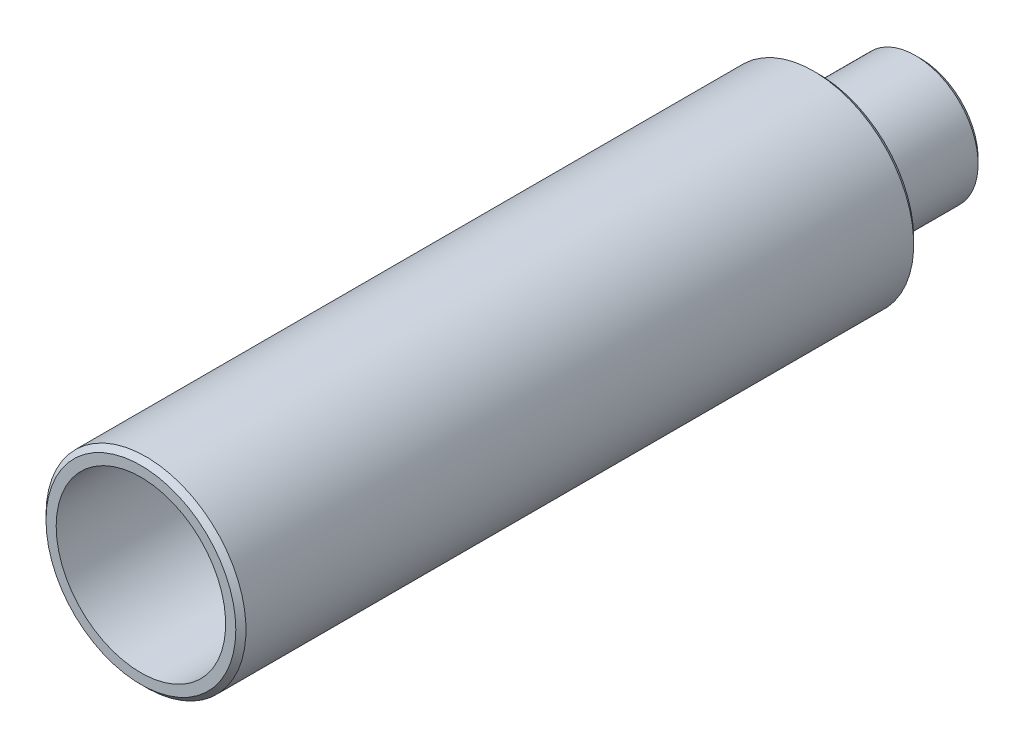
ISO-10303-21;
HEADER;
FILE_DESCRIPTION(('STEP AP214'),'2;1');
FILE_NAME('part.step','',(''),(''),'','','');
FILE_SCHEMA(('AUTOMOTIVE_DESIGN { 1 0 10303 214 1 1 1 1 }'));
ENDSEC;
DATA;
#1=APPLICATION_CONTEXT('core data for automotive mechanical design processes');
#2=APPLICATION_PROTOCOL_DEFINITION('international standard','automotive_design',2000,#1);
#3=PRODUCT_CONTEXT('',#1,'mechanical');
#4=PRODUCT('Part','Part','',(#3));
#5=PRODUCT_RELATED_PRODUCT_CATEGORY('part','',(#4));
#6=PRODUCT_DEFINITION_FORMATION('','',#4);
#7=PRODUCT_DEFINITION_CONTEXT('part definition',#1,'design');
#8=PRODUCT_DEFINITION('design','',#6,#7);
#9=PRODUCT_DEFINITION_SHAPE('','',#8);
#10=(LENGTH_UNIT() NAMED_UNIT(*) SI_UNIT(.MILLI.,.METRE.));
#11=(NAMED_UNIT(*) PLANE_ANGLE_UNIT() SI_UNIT($,.RADIAN.));
#12=(NAMED_UNIT(*) SI_UNIT($,.STERADIAN.) SOLID_ANGLE_UNIT());
#13=UNCERTAINTY_MEASURE_WITH_UNIT(LENGTH_MEASURE(1.E-05),#10,'distance_accuracy_value','');
#14=(GEOMETRIC_REPRESENTATION_CONTEXT(3) GLOBAL_UNCERTAINTY_ASSIGNED_CONTEXT((#13)) GLOBAL_UNIT_ASSIGNED_CONTEXT((#10,
#11,#12)) REPRESENTATION_CONTEXT('',''));
#15=CARTESIAN_POINT('',(0.,0.,0.));
#16=DIRECTION('',(0.,0.,1.));
#17=DIRECTION('',(1.,0.,0.));
#18=AXIS2_PLACEMENT_3D('',#15,#16,#17);
#19=CARTESIAN_POINT('',(0.,0.,40.));
#20=DIRECTION('',(0.,0.,-1.));
#21=DIRECTION('',(-1.,0.,0.));
#22=AXIS2_PLACEMENT_3D('',#19,#20,#21);
#23=PLANE('',#22);
#24=CARTESIAN_POINT('',(0.,0.,40.));
#25=DIRECTION('',(0.,0.,-1.));
#26=DIRECTION('',(-1.,0.,0.));
#27=AXIS2_PLACEMENT_3D('',#24,#25,#26);
#28=CIRCLE('',#27,5.6);
#29=CARTESIAN_POINT('',(-5.6,0.,40.));
#30=VERTEX_POINT('',#29);
#31=EDGE_CURVE('E10',#30,#30,#28,.T.);
#32=ORIENTED_EDGE('',*,*,#31,.F.);
#33=EDGE_LOOP('',(#32));
#34=FACE_BOUND('',#33,.T.);
#35=CARTESIAN_POINT('',(0.,0.,40.));
#36=DIRECTION('',(0.,0.,-1.));
#37=DIRECTION('',(-1.,0.,0.));
#38=AXIS2_PLACEMENT_3D('',#35,#36,#37);
#39=CIRCLE('',#38,5.);
#40=CARTESIAN_POINT('',(-4.99999999999999,0.,40.));
#41=VERTEX_POINT('',#40);
#42=EDGE_CURVE('E92',#41,#41,#39,.T.);
#43=ORIENTED_EDGE('',*,*,#42,.T.);
#44=EDGE_LOOP('',(#43));
#45=FACE_BOUND('',#44,.T.);
#46=ADVANCED_FACE('F43',(#34,#45),#23,.F.);
#47=CARTESIAN_POINT('',(0.,0.,40.));
#48=DIRECTION('',(0.,0.,-1.));
#49=DIRECTION('',(-1.,0.,0.));
#50=AXIS2_PLACEMENT_3D('',#47,#48,#49);
#51=CONICAL_SURFACE('',#50,5.6,0.785398163397445);
#52=CARTESIAN_POINT('',(0.,0.,39.7));
#53=DIRECTION('',(0.,0.,-1.));
#54=DIRECTION('',(-1.,0.,0.));
#55=AXIS2_PLACEMENT_3D('',#52,#53,#54);
#56=CIRCLE('',#55,5.9);
#57=CARTESIAN_POINT('',(-5.9,0.,39.7));
#58=VERTEX_POINT('',#57);
#59=EDGE_CURVE('E49',#58,#58,#56,.T.);
#60=ORIENTED_EDGE('',*,*,#59,.F.);
#61=EDGE_LOOP('',(#60));
#62=FACE_BOUND('',#61,.T.);
#63=ORIENTED_EDGE('',*,*,#31,.T.);
#64=EDGE_LOOP('',(#63));
#65=FACE_BOUND('',#64,.T.);
#66=ADVANCED_FACE('F109',(#62,#65),#51,.T.);
#67=CARTESIAN_POINT('',(0.,0.,0.));
#68=DIRECTION('',(0.,0.,-1.));
#69=DIRECTION('',(-1.,0.,0.));
#70=AXIS2_PLACEMENT_3D('',#67,#68,#69);
#71=CYLINDRICAL_SURFACE('',#70,5.9);
#72=ORIENTED_EDGE('',*,*,#59,.T.);
#73=EDGE_LOOP('',(#72));
#74=FACE_BOUND('',#73,.T.);
#75=CARTESIAN_POINT('',(0.,0.,0.300000000000001));
#76=DIRECTION('',(0.,0.,-1.));
#77=DIRECTION('',(-1.,0.,0.));
#78=AXIS2_PLACEMENT_3D('',#75,#76,#77);
#79=CIRCLE('',#78,5.9);
#80=CARTESIAN_POINT('',(-5.9,0.,0.300000000000001));
#81=VERTEX_POINT('',#80);
#82=EDGE_CURVE('E53',#81,#81,#79,.T.);
#83=ORIENTED_EDGE('',*,*,#82,.F.);
#84=EDGE_LOOP('',(#83));
#85=FACE_BOUND('',#84,.T.);
#86=ADVANCED_FACE('F114',(#74,#85),#71,.T.);
#87=CARTESIAN_POINT('',(0.,0.,0.));
#88=DIRECTION('',(0.,0.,1.));
#89=DIRECTION('',(1.,0.,0.));
#90=AXIS2_PLACEMENT_3D('',#87,#88,#89);
#91=CONICAL_SURFACE('',#90,5.6,0.785398163397448);
#92=ORIENTED_EDGE('',*,*,#82,.T.);
#93=EDGE_LOOP('',(#92));
#94=FACE_BOUND('',#93,.T.);
#95=CARTESIAN_POINT('',(0.,0.,0.));
#96=DIRECTION('',(0.,0.,-1.));
#97=DIRECTION('',(-1.,0.,0.));
#98=AXIS2_PLACEMENT_3D('',#95,#96,#97);
#99=CIRCLE('',#98,5.6);
#100=CARTESIAN_POINT('',(-5.6,0.,0.));
#101=VERTEX_POINT('',#100);
#102=EDGE_CURVE('E57',#101,#101,#99,.T.);
#103=ORIENTED_EDGE('',*,*,#102,.F.);
#104=EDGE_LOOP('',(#103));
#105=FACE_BOUND('',#104,.T.);
#106=ADVANCED_FACE('F120',(#94,#105),#91,.T.);
#107=CARTESIAN_POINT('',(0.,0.,0.));
#108=DIRECTION('',(0.,0.,-1.));
#109=DIRECTION('',(-1.,0.,0.));
#110=AXIS2_PLACEMENT_3D('',#107,#108,#109);
#111=PLANE('',#110);
#112=ORIENTED_EDGE('',*,*,#102,.T.);
#113=EDGE_LOOP('',(#112));
#114=FACE_BOUND('',#113,.T.);
#115=CARTESIAN_POINT('',(0.,0.,0.));
#116=DIRECTION('',(0.,0.,-1.));
#117=DIRECTION('',(-1.,0.,0.));
#118=AXIS2_PLACEMENT_3D('',#115,#116,#117);
#119=CIRCLE('',#118,3.7);
#120=CARTESIAN_POINT('',(-3.7,0.,0.));
#121=VERTEX_POINT('',#120);
#122=EDGE_CURVE('E62',#121,#121,#119,.T.);
#123=ORIENTED_EDGE('',*,*,#122,.F.);
#124=EDGE_LOOP('',(#123));
#125=FACE_BOUND('',#124,.T.);
#126=ADVANCED_FACE('F125',(#114,#125),#111,.T.);
#127=CARTESIAN_POINT('',(0.,0.,0.));
#128=DIRECTION('',(0.,0.,-1.));
#129=DIRECTION('',(-1.,0.,0.));
#130=AXIS2_PLACEMENT_3D('',#127,#128,#129);
#131=CYLINDRICAL_SURFACE('',#130,3.7);
#132=CARTESIAN_POINT('',(0.,0.,-5.7));
#133=DIRECTION('',(0.,0.,-1.));
#134=DIRECTION('',(-1.,0.,0.));
#135=AXIS2_PLACEMENT_3D('',#132,#133,#134);
#136=CIRCLE('',#135,3.7);
#137=CARTESIAN_POINT('',(-3.7,0.,-5.7));
#138=VERTEX_POINT('',#137);
#139=EDGE_CURVE('E65',#138,#138,#136,.T.);
#140=ORIENTED_EDGE('',*,*,#139,.F.);
#141=EDGE_LOOP('',(#140));
#142=FACE_BOUND('',#141,.T.);
#143=ORIENTED_EDGE('',*,*,#122,.T.);
#144=EDGE_LOOP('',(#143));
#145=FACE_BOUND('',#144,.T.);
#146=ADVANCED_FACE('F129',(#142,#145),#131,.T.);
#147=CARTESIAN_POINT('',(0.,0.,-6.));
#148=DIRECTION('',(0.,0.,1.));
#149=DIRECTION('',(1.,0.,0.));
#150=AXIS2_PLACEMENT_3D('',#147,#148,#149);
#151=CONICAL_SURFACE('',#150,3.4,0.785398163397448);
#152=ORIENTED_EDGE('',*,*,#139,.T.);
#153=EDGE_LOOP('',(#152));
#154=FACE_BOUND('',#153,.T.);
#155=CARTESIAN_POINT('',(0.,0.,-6.));
#156=DIRECTION('',(0.,0.,-1.));
#157=DIRECTION('',(-1.,0.,0.));
#158=AXIS2_PLACEMENT_3D('',#155,#156,#157);
#159=CIRCLE('',#158,3.4);
#160=CARTESIAN_POINT('',(-3.4,0.,-6.));
#161=VERTEX_POINT('',#160);
#162=EDGE_CURVE('E68',#161,#161,#159,.T.);
#163=ORIENTED_EDGE('',*,*,#162,.F.);
#164=EDGE_LOOP('',(#163));
#165=FACE_BOUND('',#164,.T.);
#166=ADVANCED_FACE('F133',(#154,#165),#151,.T.);
#167=CARTESIAN_POINT('',(0.,0.,-6.));
#168=DIRECTION('',(0.,0.,-1.));
#169=DIRECTION('',(-1.,0.,0.));
#170=AXIS2_PLACEMENT_3D('',#167,#168,#169);
#171=PLANE('',#170);
#172=ORIENTED_EDGE('',*,*,#162,.T.);
#173=EDGE_LOOP('',(#172));
#174=FACE_BOUND('',#173,.T.);
#175=CARTESIAN_POINT('',(0.,0.,-6.));
#176=DIRECTION('',(0.,0.,-1.));
#177=DIRECTION('',(-1.,0.,0.));
#178=AXIS2_PLACEMENT_3D('',#175,#176,#177);
#179=CIRCLE('',#178,3.);
#180=CARTESIAN_POINT('',(-3.,0.,-6.));
#181=VERTEX_POINT('',#180);
#182=EDGE_CURVE('E71',#181,#181,#179,.T.);
#183=ORIENTED_EDGE('',*,*,#182,.F.);
#184=EDGE_LOOP('',(#183));
#185=FACE_BOUND('',#184,.T.);
#186=ADVANCED_FACE('F137',(#174,#185),#171,.T.);
#187=CARTESIAN_POINT('',(0.,0.,0.));
#188=DIRECTION('',(0.,0.,-1.));
#189=DIRECTION('',(-1.,0.,0.));
#190=AXIS2_PLACEMENT_3D('',#187,#188,#189);
#191=CYLINDRICAL_SURFACE('',#190,3.);
#192=CARTESIAN_POINT('',(0.,0.,-2.5));
#193=DIRECTION('',(0.,0.,-1.));
#194=DIRECTION('',(-1.,0.,0.));
#195=AXIS2_PLACEMENT_3D('',#192,#193,#194);
#196=CIRCLE('',#195,3.);
#197=CARTESIAN_POINT('',(-3.,0.,-2.5));
#198=VERTEX_POINT('',#197);
#199=EDGE_CURVE('E74',#198,#198,#196,.T.);
#200=ORIENTED_EDGE('',*,*,#199,.F.);
#201=EDGE_LOOP('',(#200));
#202=FACE_BOUND('',#201,.T.);
#203=ORIENTED_EDGE('',*,*,#182,.T.);
#204=EDGE_LOOP('',(#203));
#205=FACE_BOUND('',#204,.T.);
#206=ADVANCED_FACE('F141',(#202,#205),#191,.F.);
#207=CARTESIAN_POINT('',(0.,0.,-2.5));
#208=DIRECTION('',(0.,0.,1.));
#209=DIRECTION('',(1.,0.,0.));
#210=AXIS2_PLACEMENT_3D('',#207,#208,#209);
#211=PLANE('',#210);
#212=CARTESIAN_POINT('',(0.,0.,-2.5));
#213=DIRECTION('',(0.,0.,-1.));
#214=DIRECTION('',(-1.,0.,0.));
#215=AXIS2_PLACEMENT_3D('',#212,#213,#214);
#216=CIRCLE('',#215,1.85);
#217=CARTESIAN_POINT('',(-1.85,0.,-2.5));
#218=VERTEX_POINT('',#217);
#219=EDGE_CURVE('E77',#218,#218,#216,.T.);
#220=ORIENTED_EDGE('',*,*,#219,.F.);
#221=EDGE_LOOP('',(#220));
#222=FACE_BOUND('',#221,.T.);
#223=ORIENTED_EDGE('',*,*,#199,.T.);
#224=EDGE_LOOP('',(#223));
#225=FACE_BOUND('',#224,.T.);
#226=ADVANCED_FACE('F145',(#222,#225),#211,.F.);
#227=CARTESIAN_POINT('',(0.,0.,-2.5));
#228=DIRECTION('',(0.,0.,-1.));
#229=DIRECTION('',(-1.,0.,0.));
#230=AXIS2_PLACEMENT_3D('',#227,#228,#229);
#231=CONICAL_SURFACE('',#230,1.85,0.785398163397449);
#232=CARTESIAN_POINT('',(0.,0.,-2.2));
#233=DIRECTION('',(0.,0.,-1.));
#234=DIRECTION('',(-1.,0.,0.));
#235=AXIS2_PLACEMENT_3D('',#232,#233,#234);
#236=CIRCLE('',#235,1.55);
#237=CARTESIAN_POINT('',(-1.55,0.,-2.2));
#238=VERTEX_POINT('',#237);
#239=EDGE_CURVE('E80',#238,#238,#236,.T.);
#240=ORIENTED_EDGE('',*,*,#239,.F.);
#241=EDGE_LOOP('',(#240));
#242=FACE_BOUND('',#241,.T.);
#243=ORIENTED_EDGE('',*,*,#219,.T.);
#244=EDGE_LOOP('',(#243));
#245=FACE_BOUND('',#244,.T.);
#246=ADVANCED_FACE('F149',(#242,#245),#231,.F.);
#247=CARTESIAN_POINT('',(0.,0.,0.));
#248=DIRECTION('',(0.,0.,-1.));
#249=DIRECTION('',(-1.,0.,0.));
#250=AXIS2_PLACEMENT_3D('',#247,#248,#249);
#251=CYLINDRICAL_SURFACE('',#250,1.55);
#252=CARTESIAN_POINT('',(0.,0.,1.2));
#253=DIRECTION('',(0.,0.,-1.));
#254=DIRECTION('',(-1.,0.,0.));
#255=AXIS2_PLACEMENT_3D('',#252,#253,#254);
#256=CIRCLE('',#255,1.55);
#257=CARTESIAN_POINT('',(-1.55,0.,1.2));
#258=VERTEX_POINT('',#257);
#259=EDGE_CURVE('E83',#258,#258,#256,.T.);
#260=ORIENTED_EDGE('',*,*,#259,.F.);
#261=EDGE_LOOP('',(#260));
#262=FACE_BOUND('',#261,.T.);
#263=ORIENTED_EDGE('',*,*,#239,.T.);
#264=EDGE_LOOP('',(#263));
#265=FACE_BOUND('',#264,.T.);
#266=ADVANCED_FACE('F153',(#262,#265),#251,.F.);
#267=CARTESIAN_POINT('',(0.,0.,2.5));
#268=DIRECTION('',(0.,0.,1.));
#269=DIRECTION('',(1.,0.,0.));
#270=AXIS2_PLACEMENT_3D('',#267,#268,#269);
#271=CONICAL_SURFACE('',#270,2.85,0.785398163397448);
#272=ORIENTED_EDGE('',*,*,#259,.T.);
#273=EDGE_LOOP('',(#272));
#274=FACE_BOUND('',#273,.T.);
#275=CARTESIAN_POINT('',(0.,0.,2.5));
#276=DIRECTION('',(0.,0.,-1.));
#277=DIRECTION('',(-1.,0.,0.));
#278=AXIS2_PLACEMENT_3D('',#275,#276,#277);
#279=CIRCLE('',#278,2.85);
#280=CARTESIAN_POINT('',(-2.85,0.,2.5));
#281=VERTEX_POINT('',#280);
#282=EDGE_CURVE('E86',#281,#281,#279,.T.);
#283=ORIENTED_EDGE('',*,*,#282,.F.);
#284=EDGE_LOOP('',(#283));
#285=FACE_BOUND('',#284,.T.);
#286=ADVANCED_FACE('F105',(#274,#285),#271,.F.);
#287=CARTESIAN_POINT('',(0.,0.,2.5));
#288=DIRECTION('',(0.,0.,1.));
#289=DIRECTION('',(1.,0.,0.));
#290=AXIS2_PLACEMENT_3D('',#287,#288,#289);
#291=PLANE('',#290);
#292=ORIENTED_EDGE('',*,*,#282,.T.);
#293=EDGE_LOOP('',(#292));
#294=FACE_BOUND('',#293,.T.);
#295=CARTESIAN_POINT('',(0.,0.,2.5));
#296=DIRECTION('',(0.,0.,-1.));
#297=DIRECTION('',(-1.,0.,0.));
#298=AXIS2_PLACEMENT_3D('',#295,#296,#297);
#299=CIRCLE('',#298,5.);
#300=CARTESIAN_POINT('',(-5.,0.,2.5));
#301=VERTEX_POINT('',#300);
#302=EDGE_CURVE('E89',#301,#301,#299,.T.);
#303=ORIENTED_EDGE('',*,*,#302,.F.);
#304=EDGE_LOOP('',(#303));
#305=FACE_BOUND('',#304,.T.);
#306=ADVANCED_FACE('F99',(#294,#305),#291,.T.);
#307=CARTESIAN_POINT('',(0.,0.,0.));
#308=DIRECTION('',(0.,0.,-1.));
#309=DIRECTION('',(-1.,0.,0.));
#310=AXIS2_PLACEMENT_3D('',#307,#308,#309);
#311=CYLINDRICAL_SURFACE('',#310,5.);
#312=ORIENTED_EDGE('',*,*,#302,.T.);
#313=EDGE_LOOP('',(#312));
#314=FACE_BOUND('',#313,.T.);
#315=ORIENTED_EDGE('',*,*,#42,.F.);
#316=EDGE_LOOP('',(#315));
#317=FACE_BOUND('',#316,.T.);
#318=ADVANCED_FACE('F97',(#314,#317),#311,.F.);
#319=CLOSED_SHELL('',(#46,#66,#86,#106,#126,#146,#166,#186,#206,#226,#246,#266,#286,#306,#318));
#320=MANIFOLD_SOLID_BREP('B2',#319);
#321=ADVANCED_BREP_SHAPE_REPRESENTATION('',(#18,#320),#14);
#322=SHAPE_DEFINITION_REPRESENTATION(#9,#321);
ENDSEC;
END-ISO-10303-21;
